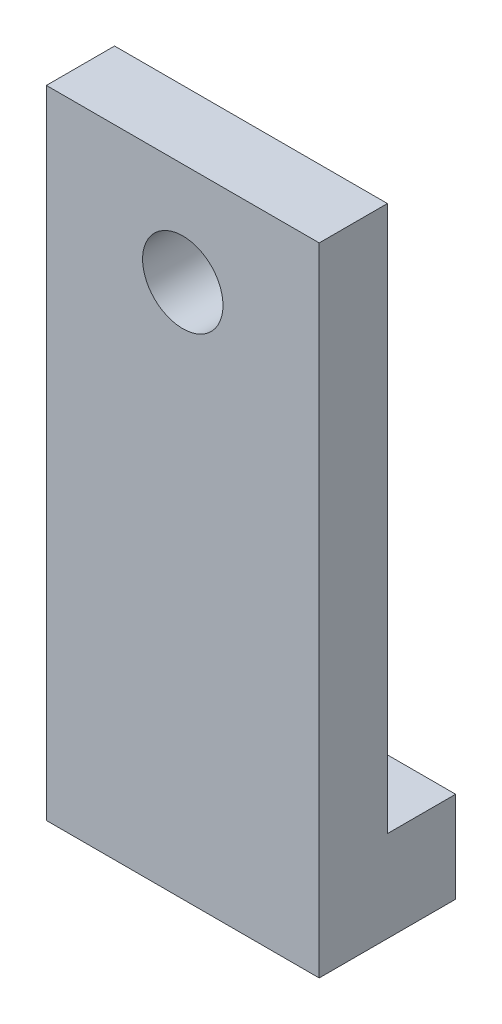
ISO-10303-21;
HEADER;
FILE_DESCRIPTION(('STEP AP214'),'2;1');
FILE_NAME('part.step','',(''),(''),'','','');
FILE_SCHEMA(('AUTOMOTIVE_DESIGN { 1 0 10303 214 1 1 1 1 }'));
ENDSEC;
DATA;
#1=APPLICATION_CONTEXT('core data for automotive mechanical design processes');
#2=APPLICATION_PROTOCOL_DEFINITION('international standard','automotive_design',2000,#1);
#3=PRODUCT_CONTEXT('',#1,'mechanical');
#4=PRODUCT('Part','Part','',(#3));
#5=PRODUCT_RELATED_PRODUCT_CATEGORY('part','',(#4));
#6=PRODUCT_DEFINITION_FORMATION('','',#4);
#7=PRODUCT_DEFINITION_CONTEXT('part definition',#1,'design');
#8=PRODUCT_DEFINITION('design','',#6,#7);
#9=PRODUCT_DEFINITION_SHAPE('','',#8);
#10=(LENGTH_UNIT() NAMED_UNIT(*) SI_UNIT(.MILLI.,.METRE.));
#11=(NAMED_UNIT(*) PLANE_ANGLE_UNIT() SI_UNIT($,.RADIAN.));
#12=(NAMED_UNIT(*) SI_UNIT($,.STERADIAN.) SOLID_ANGLE_UNIT());
#13=UNCERTAINTY_MEASURE_WITH_UNIT(LENGTH_MEASURE(1.E-05),#10,'distance_accuracy_value','');
#14=(GEOMETRIC_REPRESENTATION_CONTEXT(3) GLOBAL_UNCERTAINTY_ASSIGNED_CONTEXT((#13)) GLOBAL_UNIT_ASSIGNED_CONTEXT((#10,
#11,#12)) REPRESENTATION_CONTEXT('',''));
#15=CARTESIAN_POINT('',(0.,0.,0.));
#16=DIRECTION('',(0.,0.,1.));
#17=DIRECTION('',(1.,0.,0.));
#18=AXIS2_PLACEMENT_3D('',#15,#16,#17);
#19=CARTESIAN_POINT('',(19.05,6.35,0.));
#20=DIRECTION('',(0.,0.,1.));
#21=DIRECTION('',(0.,-1.,0.));
#22=AXIS2_PLACEMENT_3D('',#19,#20,#21);
#23=PLANE('',#22);
#24=DIRECTION('',(0.,1.,0.));
#25=VECTOR('',#24,1.);
#26=CARTESIAN_POINT('',(0.,6.35,0.));
#27=LINE('',#26,#25);
#28=CARTESIAN_POINT('',(0.,0.,0.));
#29=VERTEX_POINT('',#28);
#30=CARTESIAN_POINT('',(0.,6.35,0.));
#31=VERTEX_POINT('',#30);
#32=EDGE_CURVE('E88',#29,#31,#27,.T.);
#33=ORIENTED_EDGE('',*,*,#32,.T.);
#34=DIRECTION('',(-1.,0.,0.));
#35=VECTOR('',#34,1.);
#36=CARTESIAN_POINT('',(19.05,6.35,0.));
#37=LINE('',#36,#35);
#38=CARTESIAN_POINT('',(19.05,6.35,0.));
#39=VERTEX_POINT('',#38);
#40=EDGE_CURVE('E11',#39,#31,#37,.T.);
#41=ORIENTED_EDGE('',*,*,#40,.F.);
#42=DIRECTION('',(0.,1.,0.));
#43=VECTOR('',#42,1.);
#44=CARTESIAN_POINT('',(19.05,6.35,0.));
#45=LINE('',#44,#43);
#46=CARTESIAN_POINT('',(19.05,0.,0.));
#47=VERTEX_POINT('',#46);
#48=EDGE_CURVE('E116',#47,#39,#45,.T.);
#49=ORIENTED_EDGE('',*,*,#48,.F.);
#50=DIRECTION('',(-1.,0.,0.));
#51=VECTOR('',#50,1.);
#52=CARTESIAN_POINT('',(19.05,0.,0.));
#53=LINE('',#52,#51);
#54=EDGE_CURVE('E101',#47,#29,#53,.T.);
#55=ORIENTED_EDGE('',*,*,#54,.T.);
#56=EDGE_LOOP('',(#33,#41,#49,#55));
#57=FACE_BOUND('',#56,.T.);
#58=ADVANCED_FACE('F32',(#57),#23,.F.);
#59=CARTESIAN_POINT('',(19.05,6.35,4.76249999999999));
#60=DIRECTION('',(0.,-1.,0.));
#61=DIRECTION('',(0.,0.,-1.));
#62=AXIS2_PLACEMENT_3D('',#59,#60,#61);
#63=PLANE('',#62);
#64=DIRECTION('',(0.,0.,1.));
#65=VECTOR('',#64,1.);
#66=CARTESIAN_POINT('',(0.,6.35,4.76249999999999));
#67=LINE('',#66,#65);
#68=CARTESIAN_POINT('',(0.,6.35,4.76249999999999));
#69=VERTEX_POINT('',#68);
#70=EDGE_CURVE('E84',#31,#69,#67,.T.);
#71=ORIENTED_EDGE('',*,*,#70,.T.);
#72=DIRECTION('',(-1.,0.,0.));
#73=VECTOR('',#72,1.);
#74=CARTESIAN_POINT('',(19.05,6.35,4.76249999999999));
#75=LINE('',#74,#73);
#76=CARTESIAN_POINT('',(19.05,6.35,4.76249999999999));
#77=VERTEX_POINT('',#76);
#78=EDGE_CURVE('E39',#77,#69,#75,.T.);
#79=ORIENTED_EDGE('',*,*,#78,.F.);
#80=DIRECTION('',(0.,0.,1.));
#81=VECTOR('',#80,1.);
#82=CARTESIAN_POINT('',(19.05,6.35,4.76249999999999));
#83=LINE('',#82,#81);
#84=EDGE_CURVE('E97',#39,#77,#83,.T.);
#85=ORIENTED_EDGE('',*,*,#84,.F.);
#86=ORIENTED_EDGE('',*,*,#40,.T.);
#87=EDGE_LOOP('',(#71,#79,#85,#86));
#88=FACE_BOUND('',#87,.T.);
#89=ADVANCED_FACE('F96',(#88),#63,.F.);
#90=CARTESIAN_POINT('',(19.05,44.45,4.7625));
#91=DIRECTION('',(0.,0.,1.));
#92=DIRECTION('',(0.,-1.,0.));
#93=AXIS2_PLACEMENT_3D('',#90,#91,#92);
#94=PLANE('',#93);
#95=CARTESIAN_POINT('',(9.525,37.30625,4.7625));
#96=DIRECTION('',(0.,0.,1.));
#97=DIRECTION('',(0.,-1.,0.));
#98=AXIS2_PLACEMENT_3D('',#95,#96,#97);
#99=CIRCLE('',#98,2.80669999999999);
#100=CARTESIAN_POINT('',(9.525,34.49955,4.7625));
#101=VERTEX_POINT('',#100);
#102=EDGE_CURVE('E102',#101,#101,#99,.T.);
#103=ORIENTED_EDGE('',*,*,#102,.T.);
#104=EDGE_LOOP('',(#103));
#105=FACE_BOUND('',#104,.T.);
#106=DIRECTION('',(0.,1.,0.));
#107=VECTOR('',#106,1.);
#108=CARTESIAN_POINT('',(0.,44.45,4.7625));
#109=LINE('',#108,#107);
#110=CARTESIAN_POINT('',(0.,44.45,4.7625));
#111=VERTEX_POINT('',#110);
#112=EDGE_CURVE('E90',#69,#111,#109,.T.);
#113=ORIENTED_EDGE('',*,*,#112,.T.);
#114=DIRECTION('',(-1.,0.,0.));
#115=VECTOR('',#114,1.);
#116=CARTESIAN_POINT('',(19.05,44.45,4.7625));
#117=LINE('',#116,#115);
#118=CARTESIAN_POINT('',(19.05,44.45,4.7625));
#119=VERTEX_POINT('',#118);
#120=EDGE_CURVE('E132',#119,#111,#117,.T.);
#121=ORIENTED_EDGE('',*,*,#120,.F.);
#122=DIRECTION('',(0.,1.,0.));
#123=VECTOR('',#122,1.);
#124=CARTESIAN_POINT('',(19.05,44.45,4.7625));
#125=LINE('',#124,#123);
#126=EDGE_CURVE('E119',#77,#119,#125,.T.);
#127=ORIENTED_EDGE('',*,*,#126,.F.);
#128=ORIENTED_EDGE('',*,*,#78,.T.);
#129=EDGE_LOOP('',(#113,#121,#127,#128));
#130=FACE_BOUND('',#129,.T.);
#131=ADVANCED_FACE('F136',(#105,#130),#94,.F.);
#132=CARTESIAN_POINT('',(19.05,44.45,9.525));
#133=DIRECTION('',(0.,-1.,0.));
#134=DIRECTION('',(0.,0.,-1.));
#135=AXIS2_PLACEMENT_3D('',#132,#133,#134);
#136=PLANE('',#135);
#137=DIRECTION('',(0.,0.,1.));
#138=VECTOR('',#137,1.);
#139=CARTESIAN_POINT('',(0.,44.45,9.525));
#140=LINE('',#139,#138);
#141=CARTESIAN_POINT('',(0.,44.45,9.525));
#142=VERTEX_POINT('',#141);
#143=EDGE_CURVE('E110',#111,#142,#140,.T.);
#144=ORIENTED_EDGE('',*,*,#143,.T.);
#145=DIRECTION('',(-1.,0.,0.));
#146=VECTOR('',#145,1.);
#147=CARTESIAN_POINT('',(19.05,44.45,9.525));
#148=LINE('',#147,#146);
#149=CARTESIAN_POINT('',(19.05,44.45,9.525));
#150=VERTEX_POINT('',#149);
#151=EDGE_CURVE('E129',#150,#142,#148,.T.);
#152=ORIENTED_EDGE('',*,*,#151,.F.);
#153=DIRECTION('',(0.,0.,1.));
#154=VECTOR('',#153,1.);
#155=CARTESIAN_POINT('',(19.05,44.45,9.525));
#156=LINE('',#155,#154);
#157=EDGE_CURVE('E121',#119,#150,#156,.T.);
#158=ORIENTED_EDGE('',*,*,#157,.F.);
#159=ORIENTED_EDGE('',*,*,#120,.T.);
#160=EDGE_LOOP('',(#144,#152,#158,#159));
#161=FACE_BOUND('',#160,.T.);
#162=ADVANCED_FACE('F142',(#161),#136,.F.);
#163=CARTESIAN_POINT('',(19.05,0.,9.525));
#164=DIRECTION('',(0.,0.,-1.));
#165=DIRECTION('',(-1.,0.,0.));
#166=AXIS2_PLACEMENT_3D('',#163,#164,#165);
#167=PLANE('',#166);
#168=CARTESIAN_POINT('',(9.525,37.30625,9.525));
#169=DIRECTION('',(0.,0.,1.));
#170=DIRECTION('',(1.,0.,0.));
#171=AXIS2_PLACEMENT_3D('',#168,#169,#170);
#172=CIRCLE('',#171,2.80669999999999);
#173=CARTESIAN_POINT('',(12.3317,37.30625,9.525));
#174=VERTEX_POINT('',#173);
#175=EDGE_CURVE('E105',#174,#174,#172,.T.);
#176=ORIENTED_EDGE('',*,*,#175,.F.);
#177=EDGE_LOOP('',(#176));
#178=FACE_BOUND('',#177,.T.);
#179=DIRECTION('',(0.,-1.,0.));
#180=VECTOR('',#179,1.);
#181=CARTESIAN_POINT('',(0.,0.,9.525));
#182=LINE('',#181,#180);
#183=CARTESIAN_POINT('',(0.,0.,9.525));
#184=VERTEX_POINT('',#183);
#185=EDGE_CURVE('E112',#142,#184,#182,.T.);
#186=ORIENTED_EDGE('',*,*,#185,.T.);
#187=DIRECTION('',(-1.,0.,0.));
#188=VECTOR('',#187,1.);
#189=CARTESIAN_POINT('',(19.05,0.,9.525));
#190=LINE('',#189,#188);
#191=CARTESIAN_POINT('',(19.05,0.,9.525));
#192=VERTEX_POINT('',#191);
#193=EDGE_CURVE('E126',#192,#184,#190,.T.);
#194=ORIENTED_EDGE('',*,*,#193,.F.);
#195=DIRECTION('',(0.,-1.,0.));
#196=VECTOR('',#195,1.);
#197=CARTESIAN_POINT('',(19.05,0.,9.525));
#198=LINE('',#197,#196);
#199=EDGE_CURVE('E51',#150,#192,#198,.T.);
#200=ORIENTED_EDGE('',*,*,#199,.F.);
#201=ORIENTED_EDGE('',*,*,#151,.T.);
#202=EDGE_LOOP('',(#186,#194,#200,#201));
#203=FACE_BOUND('',#202,.T.);
#204=ADVANCED_FACE('F145',(#178,#203),#167,.F.);
#205=CARTESIAN_POINT('',(19.05,0.,0.));
#206=DIRECTION('',(0.,1.,0.));
#207=DIRECTION('',(0.,0.,1.));
#208=AXIS2_PLACEMENT_3D('',#205,#206,#207);
#209=PLANE('',#208);
#210=DIRECTION('',(0.,0.,-1.));
#211=VECTOR('',#210,1.);
#212=CARTESIAN_POINT('',(0.,0.,0.));
#213=LINE('',#212,#211);
#214=EDGE_CURVE('E114',#184,#29,#213,.T.);
#215=ORIENTED_EDGE('',*,*,#214,.T.);
#216=ORIENTED_EDGE('',*,*,#54,.F.);
#217=DIRECTION('',(0.,0.,-1.));
#218=VECTOR('',#217,1.);
#219=CARTESIAN_POINT('',(19.05,0.,0.));
#220=LINE('',#219,#218);
#221=EDGE_CURVE('E46',#192,#47,#220,.T.);
#222=ORIENTED_EDGE('',*,*,#221,.F.);
#223=ORIENTED_EDGE('',*,*,#193,.T.);
#224=EDGE_LOOP('',(#215,#216,#222,#223));
#225=FACE_BOUND('',#224,.T.);
#226=ADVANCED_FACE('F147',(#225),#209,.F.);
#227=CARTESIAN_POINT('',(19.05,44.45,0.));
#228=DIRECTION('',(1.,0.,0.));
#229=DIRECTION('',(0.,0.,-1.));
#230=AXIS2_PLACEMENT_3D('',#227,#228,#229);
#231=PLANE('',#230);
#232=ORIENTED_EDGE('',*,*,#48,.T.);
#233=ORIENTED_EDGE('',*,*,#84,.T.);
#234=ORIENTED_EDGE('',*,*,#126,.T.);
#235=ORIENTED_EDGE('',*,*,#157,.T.);
#236=ORIENTED_EDGE('',*,*,#199,.T.);
#237=ORIENTED_EDGE('',*,*,#221,.T.);
#238=EDGE_LOOP('',(#232,#233,#234,#235,#236,#237));
#239=FACE_BOUND('',#238,.T.);
#240=ADVANCED_FACE('F139',(#239),#231,.T.);
#241=CARTESIAN_POINT('',(0.,44.45,0.));
#242=DIRECTION('',(1.,0.,0.));
#243=DIRECTION('',(0.,0.,-1.));
#244=AXIS2_PLACEMENT_3D('',#241,#242,#243);
#245=PLANE('',#244);
#246=ORIENTED_EDGE('',*,*,#32,.F.);
#247=ORIENTED_EDGE('',*,*,#214,.F.);
#248=ORIENTED_EDGE('',*,*,#185,.F.);
#249=ORIENTED_EDGE('',*,*,#143,.F.);
#250=ORIENTED_EDGE('',*,*,#112,.F.);
#251=ORIENTED_EDGE('',*,*,#70,.F.);
#252=EDGE_LOOP('',(#246,#247,#248,#249,#250,#251));
#253=FACE_BOUND('',#252,.T.);
#254=ADVANCED_FACE('F85',(#253),#245,.F.);
#255=CARTESIAN_POINT('',(9.525,37.30625,9.525));
#256=DIRECTION('',(0.,0.,1.));
#257=DIRECTION('',(1.,0.,0.));
#258=AXIS2_PLACEMENT_3D('',#255,#256,#257);
#259=CYLINDRICAL_SURFACE('',#258,2.80669999999999);
#260=ORIENTED_EDGE('',*,*,#175,.T.);
#261=EDGE_LOOP('',(#260));
#262=FACE_BOUND('',#261,.T.);
#263=ORIENTED_EDGE('',*,*,#102,.F.);
#264=EDGE_LOOP('',(#263));
#265=FACE_BOUND('',#264,.T.);
#266=ADVANCED_FACE('F185',(#262,#265),#259,.F.);
#267=CLOSED_SHELL('',(#58,#89,#131,#162,#204,#226,#240,#254,#266));
#268=MANIFOLD_SOLID_BREP('B2',#267);
#269=ADVANCED_BREP_SHAPE_REPRESENTATION('',(#18,#268),#14);
#270=SHAPE_DEFINITION_REPRESENTATION(#9,#269);
ENDSEC;
END-ISO-10303-21;
